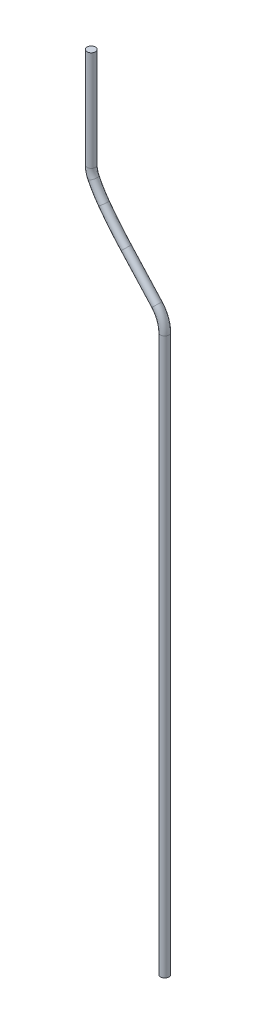
ISO-10303-21;
HEADER;
FILE_DESCRIPTION(('STEP AP214'),'2;1');
FILE_NAME('part.step','',(''),(''),'','','');
FILE_SCHEMA(('AUTOMOTIVE_DESIGN { 1 0 10303 214 1 1 1 1 }'));
ENDSEC;
DATA;
#1=APPLICATION_CONTEXT('core data for automotive mechanical design processes');
#2=APPLICATION_PROTOCOL_DEFINITION('international standard','automotive_design',2000,#1);
#3=PRODUCT_CONTEXT('',#1,'mechanical');
#4=PRODUCT('Part','Part','',(#3));
#5=PRODUCT_RELATED_PRODUCT_CATEGORY('part','',(#4));
#6=PRODUCT_DEFINITION_FORMATION('','',#4);
#7=PRODUCT_DEFINITION_CONTEXT('part definition',#1,'design');
#8=PRODUCT_DEFINITION('design','',#6,#7);
#9=PRODUCT_DEFINITION_SHAPE('','',#8);
#10=(LENGTH_UNIT() NAMED_UNIT(*) SI_UNIT(.MILLI.,.METRE.));
#11=(NAMED_UNIT(*) PLANE_ANGLE_UNIT() SI_UNIT($,.RADIAN.));
#12=(NAMED_UNIT(*) SI_UNIT($,.STERADIAN.) SOLID_ANGLE_UNIT());
#13=UNCERTAINTY_MEASURE_WITH_UNIT(LENGTH_MEASURE(1.E-05),#10,'distance_accuracy_value','');
#14=(GEOMETRIC_REPRESENTATION_CONTEXT(3) GLOBAL_UNCERTAINTY_ASSIGNED_CONTEXT((#13)) GLOBAL_UNIT_ASSIGNED_CONTEXT((#10,
#11,#12)) REPRESENTATION_CONTEXT('',''));
#15=CARTESIAN_POINT('',(0.,0.,0.));
#16=DIRECTION('',(0.,0.,1.));
#17=DIRECTION('',(1.,0.,0.));
#18=AXIS2_PLACEMENT_3D('',#15,#16,#17);
#19=CARTESIAN_POINT('',(-132.24,1375.12,0.));
#20=DIRECTION('',(0.,1.,0.));
#21=DIRECTION('',(0.,0.,1.));
#22=AXIS2_PLACEMENT_3D('',#19,#20,#21);
#23=PLANE('',#22);
#24=CARTESIAN_POINT('',(-132.24,1375.12,0.));
#25=DIRECTION('',(0.,1.,0.));
#26=DIRECTION('',(0.,0.,1.));
#27=AXIS2_PLACEMENT_3D('',#24,#25,#26);
#28=CIRCLE('',#27,7.5);
#29=CARTESIAN_POINT('',(-132.24,1375.12,7.5));
#30=VERTEX_POINT('',#29);
#31=EDGE_CURVE('E72',#30,#30,#28,.T.);
#32=ORIENTED_EDGE('',*,*,#31,.T.);
#33=EDGE_LOOP('',(#32));
#34=FACE_BOUND('',#33,.T.);
#35=ADVANCED_FACE('F37',(#34),#23,.T.);
#36=CARTESIAN_POINT('',(0.,0.,0.));
#37=DIRECTION('',(0.,1.,0.));
#38=DIRECTION('',(0.,0.,1.));
#39=AXIS2_PLACEMENT_3D('',#36,#37,#38);
#40=PLANE('',#39);
#41=CARTESIAN_POINT('',(0.,0.,0.));
#42=DIRECTION('',(0.,1.,0.));
#43=DIRECTION('',(0.,0.,1.));
#44=AXIS2_PLACEMENT_3D('',#41,#42,#43);
#45=CIRCLE('',#44,7.5);
#46=CARTESIAN_POINT('',(0.,0.,7.5));
#47=VERTEX_POINT('',#46);
#48=EDGE_CURVE('E10',#47,#47,#45,.T.);
#49=ORIENTED_EDGE('',*,*,#48,.F.);
#50=EDGE_LOOP('',(#49));
#51=FACE_BOUND('',#50,.T.);
#52=ADVANCED_FACE('F81',(#51),#40,.F.);
#53=CARTESIAN_POINT('',(-132.24,1375.12,0.));
#54=DIRECTION('',(0.,-1.,0.));
#55=DIRECTION('',(1.,0.,0.));
#56=AXIS2_PLACEMENT_3D('',#53,#54,#55);
#57=CYLINDRICAL_SURFACE('',#56,7.5);
#58=CARTESIAN_POINT('',(-132.24,1195.02523885926,0.));
#59=DIRECTION('',(0.,1.,0.));
#60=DIRECTION('',(0.,0.,1.));
#61=AXIS2_PLACEMENT_3D('',#58,#59,#60);
#62=CIRCLE('',#61,7.5);
#63=CARTESIAN_POINT('',(-139.74,1195.02523885926,0.));
#64=VERTEX_POINT('',#63);
#65=EDGE_CURVE('E68',#64,#64,#62,.T.);
#66=ORIENTED_EDGE('',*,*,#65,.T.);
#67=EDGE_LOOP('',(#66));
#68=FACE_BOUND('',#67,.T.);
#69=ORIENTED_EDGE('',*,*,#31,.F.);
#70=EDGE_LOOP('',(#69));
#71=FACE_BOUND('',#70,.T.);
#72=ADVANCED_FACE('F78',(#68,#71),#57,.T.);
#73=CARTESIAN_POINT('',(-92.24,1195.02523885926,0.));
#74=DIRECTION('',(0.,0.,1.));
#75=DIRECTION('',(1.,0.,0.));
#76=AXIS2_PLACEMENT_3D('',#73,#74,#75);
#77=TOROIDAL_SURFACE('',#76,40.,7.5);
#78=CARTESIAN_POINT('',(-128.192165763146,1177.49122115255,0.));
#79=DIRECTION('',(-0.438350442667773,0.898804144078657,0.));
#80=DIRECTION('',(0.,0.,1.));
#81=AXIS2_PLACEMENT_3D('',#78,#79,#80);
#82=CIRCLE('',#81,7.5);
#83=CARTESIAN_POINT('',(-134.933196843736,1174.20359283254,0.));
#84=VERTEX_POINT('',#83);
#85=EDGE_CURVE('E64',#84,#84,#82,.T.);
#86=CARTESIAN_POINT('',(-92.24,1195.02523885926,0.));
#87=DIRECTION('',(0.,0.,1.));
#88=DIRECTION('',(1.,0.,0.));
#89=AXIS2_PLACEMENT_3D('',#86,#87,#88);
#90=CIRCLE('',#89,47.5);
#91=EDGE_CURVE('',#64,#84,#90,.T.);
#92=ORIENTED_EDGE('',*,*,#65,.F.);
#93=ORIENTED_EDGE('',*,*,#85,.T.);
#94=ORIENTED_EDGE('',*,*,#91,.T.);
#95=ORIENTED_EDGE('',*,*,#91,.F.);
#96=EDGE_LOOP('',(#92,#94,#93,#95));
#97=FACE_BOUND('',#96,.T.);
#98=ADVANCED_FACE('F80',(#97),#77,.T.);
#99=CARTESIAN_POINT('',(51.5686630525748,1265.16130968609,0.));
#100=DIRECTION('',(0.,0.,1.));
#101=DIRECTION('',(1.,0.,0.));
#102=AXIS2_PLACEMENT_3D('',#99,#100,#101);
#103=TOROIDAL_SURFACE('',#102,199.999999999994,7.5);
#104=CARTESIAN_POINT('',(-109.639999999995,1146.79,0.));
#105=DIRECTION('',(-0.591856548430475,0.806043315262874,0.));
#106=DIRECTION('',(0.,0.,1.));
#107=AXIS2_PLACEMENT_3D('',#104,#105,#106);
#108=CIRCLE('',#107,7.5);
#109=CARTESIAN_POINT('',(-115.685324864467,1142.35107588677,0.));
#110=VERTEX_POINT('',#109);
#111=EDGE_CURVE('E60',#110,#110,#108,.T.);
#112=CARTESIAN_POINT('',(51.5686630525748,1265.16130968609,0.));
#113=DIRECTION('',(0.,0.,1.));
#114=DIRECTION('',(1.,0.,0.));
#115=AXIS2_PLACEMENT_3D('',#112,#113,#114);
#116=CIRCLE('',#115,207.499999999994);
#117=EDGE_CURVE('',#84,#110,#116,.T.);
#118=ORIENTED_EDGE('',*,*,#85,.F.);
#119=ORIENTED_EDGE('',*,*,#111,.T.);
#120=ORIENTED_EDGE('',*,*,#117,.T.);
#121=ORIENTED_EDGE('',*,*,#117,.F.);
#122=EDGE_LOOP('',(#118,#120,#119,#121));
#123=FACE_BOUND('',#122,.T.);
#124=ADVANCED_FACE('F88',(#123),#103,.T.);
#125=CARTESIAN_POINT('',(373.985989157724,1501.90392905828,0.));
#126=DIRECTION('',(0.,0.,1.));
#127=DIRECTION('',(1.,0.,0.));
#128=AXIS2_PLACEMENT_3D('',#125,#126,#127);
#129=TOROIDAL_SURFACE('',#128,600.,7.5);
#130=CARTESIAN_POINT('',(-69.488938494428,1097.76287875045,0.));
#131=DIRECTION('',(-0.673568417179721,0.739124879420254,0.));
#132=DIRECTION('',(0.,0.,1.));
#133=AXIS2_PLACEMENT_3D('',#130,#131,#132);
#134=CIRCLE('',#133,7.5);
#135=CARTESIAN_POINT('',(-75.03237509008,1092.7111156216,0.));
#136=VERTEX_POINT('',#135);
#137=EDGE_CURVE('E54',#136,#136,#134,.T.);
#138=CARTESIAN_POINT('',(373.985989157724,1501.90392905828,0.));
#139=DIRECTION('',(0.,0.,1.));
#140=DIRECTION('',(1.,0.,0.));
#141=AXIS2_PLACEMENT_3D('',#138,#139,#140);
#142=CIRCLE('',#141,607.5);
#143=EDGE_CURVE('',#110,#136,#142,.T.);
#144=ORIENTED_EDGE('',*,*,#111,.F.);
#145=ORIENTED_EDGE('',*,*,#137,.T.);
#146=ORIENTED_EDGE('',*,*,#143,.T.);
#147=ORIENTED_EDGE('',*,*,#143,.F.);
#148=EDGE_LOOP('',(#144,#146,#145,#147));
#149=FACE_BOUND('',#148,.T.);
#150=ADVANCED_FACE('F105',(#149),#129,.T.);
#151=CARTESIAN_POINT('',(-17760.1719908613,-15023.8502805222,0.));
#152=DIRECTION('',(0.,0.,-1.));
#153=DIRECTION('',(-1.,0.,0.));
#154=AXIS2_PLACEMENT_3D('',#151,#152,#153);
#155=TOROIDAL_SURFACE('',#154,23934.6334360176,7.5);
#156=CARTESIAN_POINT('',(-14.2211303365585,1036.90641934641,0.));
#157=DIRECTION('',(-0.671025806298743,0.741433993880185,0.));
#158=DIRECTION('',(0.,0.,1.));
#159=AXIS2_PLACEMENT_3D('',#156,#157,#158);
#160=CIRCLE('',#159,7.5);
#161=CARTESIAN_POINT('',(-8.66037538245948,1041.93911289364,0.));
#162=VERTEX_POINT('',#161);
#163=EDGE_CURVE('E49',#162,#162,#160,.T.);
#164=ORIENTED_EDGE('',*,*,#163,.T.);
#165=EDGE_LOOP('',(#164));
#166=FACE_BOUND('',#165,.T.);
#167=ORIENTED_EDGE('',*,*,#137,.F.);
#168=EDGE_LOOP('',(#167));
#169=FACE_BOUND('',#168,.T.);
#170=ADVANCED_FACE('F99',(#166,#169),#155,.T.);
#171=CARTESIAN_POINT('',(-55.0000000000002,1000.,0.));
#172=DIRECTION('',(0.,0.,-1.));
#173=DIRECTION('',(-1.,0.,0.));
#174=AXIS2_PLACEMENT_3D('',#171,#172,#173);
#175=TOROIDAL_SURFACE('',#174,54.9999999999992,7.5);
#176=CARTESIAN_POINT('',(-9.29811783123569E-13,1000.,0.));
#177=DIRECTION('',(0.,1.,0.));
#178=DIRECTION('',(0.,0.,1.));
#179=AXIS2_PLACEMENT_3D('',#176,#177,#178);
#180=CIRCLE('',#179,7.5);
#181=CARTESIAN_POINT('',(7.499999999999,1000.,0.));
#182=VERTEX_POINT('',#181);
#183=EDGE_CURVE('E44',#182,#182,#180,.T.);
#184=CARTESIAN_POINT('',(-55.0000000000002,1000.,0.));
#185=DIRECTION('',(0.,0.,-1.));
#186=DIRECTION('',(-1.,0.,0.));
#187=AXIS2_PLACEMENT_3D('',#184,#185,#186);
#188=CIRCLE('',#187,62.4999999999992);
#189=EDGE_CURVE('',#162,#182,#188,.T.);
#190=ORIENTED_EDGE('',*,*,#163,.F.);
#191=ORIENTED_EDGE('',*,*,#183,.T.);
#192=ORIENTED_EDGE('',*,*,#189,.T.);
#193=ORIENTED_EDGE('',*,*,#189,.F.);
#194=EDGE_LOOP('',(#190,#192,#191,#193));
#195=FACE_BOUND('',#194,.T.);
#196=ADVANCED_FACE('F94',(#195),#175,.T.);
#197=CARTESIAN_POINT('',(-1.2490009027033E-13,1000.,0.));
#198=DIRECTION('',(0.,-1.,0.));
#199=DIRECTION('',(1.,0.,0.));
#200=AXIS2_PLACEMENT_3D('',#197,#198,#199);
#201=CYLINDRICAL_SURFACE('',#200,7.5);
#202=ORIENTED_EDGE('',*,*,#48,.T.);
#203=EDGE_LOOP('',(#202));
#204=FACE_BOUND('',#203,.T.);
#205=ORIENTED_EDGE('',*,*,#183,.F.);
#206=EDGE_LOOP('',(#205));
#207=FACE_BOUND('',#206,.T.);
#208=ADVANCED_FACE('F92',(#204,#207),#201,.T.);
#209=CLOSED_SHELL('',(#35,#52,#72,#98,#124,#150,#170,#196,#208));
#210=MANIFOLD_SOLID_BREP('B2',#209);
#211=ADVANCED_BREP_SHAPE_REPRESENTATION('',(#18,#210),#14);
#212=SHAPE_DEFINITION_REPRESENTATION(#9,#211);
ENDSEC;
END-ISO-10303-21;
